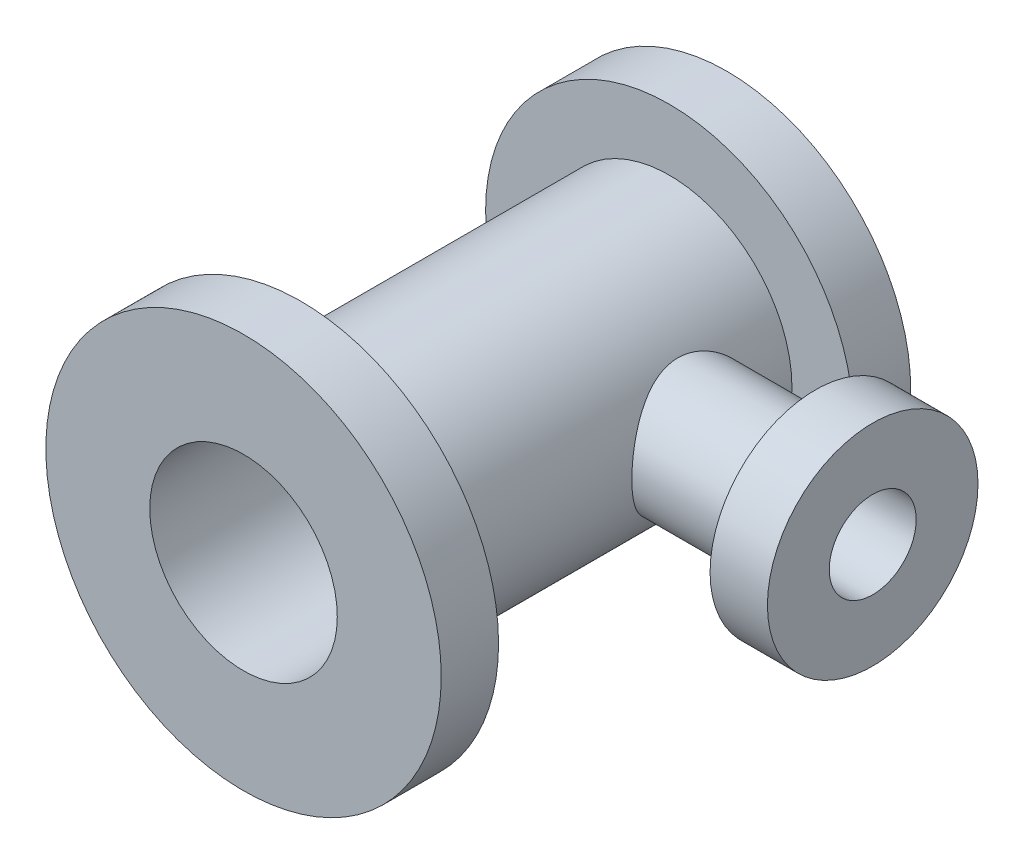
ISO-10303-21;
HEADER;
FILE_DESCRIPTION(('STEP AP214'),'2;1');
FILE_NAME('part.step','',(''),(''),'','','');
FILE_SCHEMA(('AUTOMOTIVE_DESIGN { 1 0 10303 214 1 1 1 1 }'));
ENDSEC;
DATA;
#1=APPLICATION_CONTEXT('core data for automotive mechanical design processes');
#2=APPLICATION_PROTOCOL_DEFINITION('international standard','automotive_design',2000,#1);
#3=PRODUCT_CONTEXT('',#1,'mechanical');
#4=PRODUCT('Part','Part','',(#3));
#5=PRODUCT_RELATED_PRODUCT_CATEGORY('part','',(#4));
#6=PRODUCT_DEFINITION_FORMATION('','',#4);
#7=PRODUCT_DEFINITION_CONTEXT('part definition',#1,'design');
#8=PRODUCT_DEFINITION('design','',#6,#7);
#9=PRODUCT_DEFINITION_SHAPE('','',#8);
#10=(LENGTH_UNIT() NAMED_UNIT(*) SI_UNIT(.MILLI.,.METRE.));
#11=(NAMED_UNIT(*) PLANE_ANGLE_UNIT() SI_UNIT($,.RADIAN.));
#12=(NAMED_UNIT(*) SI_UNIT($,.STERADIAN.) SOLID_ANGLE_UNIT());
#13=UNCERTAINTY_MEASURE_WITH_UNIT(LENGTH_MEASURE(1.E-05),#10,'distance_accuracy_value','');
#14=(GEOMETRIC_REPRESENTATION_CONTEXT(3) GLOBAL_UNCERTAINTY_ASSIGNED_CONTEXT((#13)) GLOBAL_UNIT_ASSIGNED_CONTEXT((#10,
#11,#12)) REPRESENTATION_CONTEXT('',''));
#15=CARTESIAN_POINT('',(0.,0.,0.));
#16=DIRECTION('',(0.,0.,1.));
#17=DIRECTION('',(1.,0.,0.));
#18=AXIS2_PLACEMENT_3D('',#15,#16,#17);
#19=CARTESIAN_POINT('',(0.,0.,113.));
#20=DIRECTION('',(0.,0.,-1.));
#21=DIRECTION('',(-1.,0.,0.));
#22=AXIS2_PLACEMENT_3D('',#19,#20,#21);
#23=CYLINDRICAL_SURFACE('',#22,29.8978260869565);
#24=CARTESIAN_POINT('',(0.,0.,99.));
#25=DIRECTION('',(0.,0.,1.));
#26=DIRECTION('',(1.,0.,0.));
#27=AXIS2_PLACEMENT_3D('',#24,#25,#26);
#28=CIRCLE('',#27,29.8978260869565);
#29=CARTESIAN_POINT('',(29.8978260869565,0.,99.));
#30=VERTEX_POINT('',#29);
#31=EDGE_CURVE('E46',#30,#30,#28,.T.);
#32=ORIENTED_EDGE('',*,*,#31,.F.);
#33=EDGE_LOOP('',(#32));
#34=FACE_BOUND('',#33,.T.);
#35=CARTESIAN_POINT('',(29.8978260869565,0.,48.0921907668277));
#36=CARTESIAN_POINT('',(29.897826796806,-0.410481878840182,48.0921916495138));
#37=CARTESIAN_POINT('',(29.8893543502388,-0.820953845497934,48.0760821582374));
#38=CARTESIAN_POINT('',(29.8556824616018,-1.63884193327181,48.0118429802466));
#39=CARTESIAN_POINT('',(29.8304768920757,-2.04625687965635,47.9637015638351));
#40=CARTESIAN_POINT('',(29.7639365853433,-2.85536546245785,47.8358991742283));
#41=CARTESIAN_POINT('',(29.7225786628537,-3.25705001041393,47.7561928901277));
#42=CARTESIAN_POINT('',(29.624784987848,-4.05119510131826,47.5662196136342));
#43=CARTESIAN_POINT('',(29.568350464529,-4.44365639340293,47.4559551126289));
#44=CARTESIAN_POINT('',(29.4420337661322,-5.21525525194695,47.2065770643136));
#45=CARTESIAN_POINT('',(29.3722069449573,-5.5944403167897,47.0675820899157));
#46=CARTESIAN_POINT('',(29.2205762304388,-6.3389489195439,46.7618288283908));
#47=CARTESIAN_POINT('',(29.1387721350128,-6.70427222344647,46.5950700728224));
#48=CARTESIAN_POINT('',(28.9650146078412,-7.41911211191844,46.2352518574877));
#49=CARTESIAN_POINT('',(28.8730627909539,-7.76863119904893,46.0421965812778));
#50=CARTESIAN_POINT('',(28.6809499559998,-8.45035877057883,45.6311856460707));
#51=CARTESIAN_POINT('',(28.5807881473273,-8.78256558279061,45.4132275881882));
#52=CARTESIAN_POINT('',(28.36764106439,-9.44918994673119,44.9389291666651));
#53=CARTESIAN_POINT('',(28.2542454025769,-9.78235862923837,44.6810175465435));
#54=CARTESIAN_POINT('',(28.0231021881324,-10.426059593368,44.140125490744));
#55=CARTESIAN_POINT('',(27.9053544799797,-10.7365910648641,43.8571441586889));
#56=CARTESIAN_POINT('',(27.6681522279021,-11.3338727125214,43.2674158074575));
#57=CARTESIAN_POINT('',(27.5486967479623,-11.620609211354,42.9606553132872));
#58=CARTESIAN_POINT('',(27.3109154586117,-12.1689466374574,42.3247616034055));
#59=CARTESIAN_POINT('',(27.1925902106816,-12.4305356028478,41.9956178665503));
#60=CARTESIAN_POINT('',(26.9498167885033,-12.9489908971984,41.2865215262227));
#61=CARTESIAN_POINT('',(26.8257467344922,-13.2034137245318,40.9046469357565));
#62=CARTESIAN_POINT('',(26.5864773943472,-13.6788170702555,40.118232127753));
#63=CARTESIAN_POINT('',(26.4712737527701,-13.8998140605697,39.7137032096071));
#64=CARTESIAN_POINT('',(26.2537205255951,-14.3064795143731,38.8840566421401));
#65=CARTESIAN_POINT('',(26.1513671841473,-14.4921583087762,38.4589450592338));
#66=CARTESIAN_POINT('',(25.9634781058224,-14.826145177324,37.5906879228836));
#67=CARTESIAN_POINT('',(25.8779403185414,-14.9744578083322,37.1475445761054));
#68=CARTESIAN_POINT('',(25.7320611804424,-15.2236852833303,36.274441167124));
#69=CARTESIAN_POINT('',(25.6704876384423,-15.3269663292125,35.8453638089964));
#70=CARTESIAN_POINT('',(25.5680123281331,-15.4973120906402,34.977622520631));
#71=CARTESIAN_POINT('',(25.5271095849252,-15.5643785141893,34.5389590435223));
#72=CARTESIAN_POINT('',(25.4678693275911,-15.6611261986547,33.6564550230244));
#73=CARTESIAN_POINT('',(25.4495088397351,-15.6908455222491,33.2126202165612));
#74=CARTESIAN_POINT('',(25.436156616008,-15.7124834448352,32.3237007852233));
#75=CARTESIAN_POINT('',(25.4411622070454,-15.7044063677543,31.8786163091335));
#76=CARTESIAN_POINT('',(25.4720304534629,-15.6542747384011,31.0518354310559));
#77=CARTESIAN_POINT('',(25.4949723486768,-15.6169768662411,30.6697288318546));
#78=CARTESIAN_POINT('',(25.5572962823597,-15.5147735910132,29.910626659278));
#79=CARTESIAN_POINT('',(25.5966765602637,-15.4498711444045,29.5336305430287));
#80=CARTESIAN_POINT('',(25.6905751152152,-15.293222949442,28.7870841772248));
#81=CARTESIAN_POINT('',(25.7450980426034,-15.2014689544531,28.4175362524795));
#82=CARTESIAN_POINT('',(25.8675698270725,-14.9921153687821,27.6881205002735));
#83=CARTESIAN_POINT('',(25.9355194612678,-14.8745142820708,27.3282532344829));
#84=CARTESIAN_POINT('',(26.0845395897857,-14.6116432450236,26.6120467842195));
#85=CARTESIAN_POINT('',(26.165870775353,-14.4658105667741,26.2559689124137));
#86=CARTESIAN_POINT('',(26.3383059162598,-14.1494204971277,25.5572978300634));
#87=CARTESIAN_POINT('',(26.429413339455,-13.9788543246044,25.214709463853));
#88=CARTESIAN_POINT('',(26.6191095350767,-13.6141563809211,24.5443954644303));
#89=CARTESIAN_POINT('',(26.7176998800904,-13.420019651078,24.2166729786331));
#90=CARTESIAN_POINT('',(26.9200678712417,-13.0093180167389,23.5773305182626));
#91=CARTESIAN_POINT('',(27.0238452871168,-12.7927541073649,23.2657098301512));
#92=CARTESIAN_POINT('',(27.2493495836431,-12.305883247851,22.6164907613336));
#93=CARTESIAN_POINT('',(27.3715317381663,-12.0323122432555,22.2814923957848));
#94=CARTESIAN_POINT('',(27.6166046595009,-11.458640790157,21.6353080911506));
#95=CARTESIAN_POINT('',(27.7394954636294,-11.1585389324042,21.3241234186262));
#96=CARTESIAN_POINT('',(27.9830222083567,-10.5329580938146,20.7268703484483));
#97=CARTESIAN_POINT('',(28.1036563298248,-10.2074596483694,20.4408215797824));
#98=CARTESIAN_POINT('',(28.3395770436382,-9.53289053275975,19.8958635755359));
#99=CARTESIAN_POINT('',(28.4548657304858,-9.18382922917537,19.6369436590884));
#100=CARTESIAN_POINT('',(28.6836232954765,-8.44323916052333,19.1340199462923));
#101=CARTESIAN_POINT('',(28.796620298209,-8.05042506768877,18.8916884997131));
#102=CARTESIAN_POINT('',(29.0103892694386,-7.24237270600434,18.4413265269522));
#103=CARTESIAN_POINT('',(29.1111605661446,-6.82713320670947,18.2332978854521));
#104=CARTESIAN_POINT('',(29.2974659708319,-5.97725530276267,17.8539356530857));
#105=CARTESIAN_POINT('',(29.3830106388235,-5.54263060584944,17.6825766142123));
#106=CARTESIAN_POINT('',(29.5363169324605,-4.65701926455056,17.3785523981369));
#107=CARTESIAN_POINT('',(29.6040808439837,-4.20603473186391,17.2458822468824));
#108=CARTESIAN_POINT('',(29.7145545779553,-3.33194600758355,17.0310414839403));
#109=CARTESIAN_POINT('',(29.758947765912,-2.90989403395334,16.9454473415893));
#110=CARTESIAN_POINT('',(29.8299181386831,-2.05871534039453,16.8091011862667));
#111=CARTESIAN_POINT('',(29.8564963483133,-1.62958902887617,16.758347169095));
#112=CARTESIAN_POINT('',(29.8910665322588,-0.768065831085699,16.6924015751397));
#113=CARTESIAN_POINT('',(29.89906710886,-0.335670551586267,16.6771935389349));
#114=CARTESIAN_POINT('',(29.8962730858333,0.528828281213647,16.6825116503364));
#115=CARTESIAN_POINT('',(29.8854794971145,0.960931848954217,16.7030358759596));
#116=CARTESIAN_POINT('',(29.8471750145983,1.78340949732516,16.7761610387292));
#117=CARTESIAN_POINT('',(29.8212108435245,2.17412420864949,16.8257955943256));
#118=CARTESIAN_POINT('',(29.7545290270125,2.94947196831378,16.9539775679393));
#119=CARTESIAN_POINT('',(29.7138124528202,3.33410545612598,17.0325228866075));
#120=CARTESIAN_POINT('',(29.6185665633512,4.09481231366989,17.2176766364355));
#121=CARTESIAN_POINT('',(29.5640365303063,4.47088523747471,17.3242865258841));
#122=CARTESIAN_POINT('',(29.4423839211606,5.21221160240684,17.5645002048226));
#123=CARTESIAN_POINT('',(29.3752608028039,5.57746457684458,17.6981051567342));
#124=CARTESIAN_POINT('',(29.2279806983522,6.30446265356324,17.9948938594646));
#125=CARTESIAN_POINT('',(29.1475312046287,6.66587198677411,18.1587539764332));
#126=CARTESIAN_POINT('',(28.9766404991293,7.37338307380989,18.5122280133582));
#127=CARTESIAN_POINT('',(28.8861992252354,7.71948473244951,18.7018420934266));
#128=CARTESIAN_POINT('',(28.6971815086286,8.39492751916615,19.1054951538063));
#129=CARTESIAN_POINT('',(28.5986028268072,8.72426399352266,19.3195408630256));
#130=CARTESIAN_POINT('',(28.3953165404155,9.36477064276463,19.7706855440698));
#131=CARTESIAN_POINT('',(28.2906083550711,9.67593909062183,20.0077867018233));
#132=CARTESIAN_POINT('',(28.065872774991,10.3107612143502,20.5299515634314));
#133=CARTESIAN_POINT('',(27.9453948444347,10.6322670318104,20.8174362557379));
#134=CARTESIAN_POINT('',(27.702404848931,11.2502010235581,21.4174240421721));
#135=CARTESIAN_POINT('',(27.5798926536419,11.5466275834645,21.7299287443507));
#136=CARTESIAN_POINT('',(27.3357995958781,12.1131856807418,22.3786407502757));
#137=CARTESIAN_POINT('',(27.2142193439545,12.3833011455285,22.7148623283607));
#138=CARTESIAN_POINT('',(26.9751763858802,12.89572987577,23.4095187286559));
#139=CARTESIAN_POINT('',(26.8577156892059,13.138029700518,23.7679641618251));
#140=CARTESIAN_POINT('',(26.6231087789152,13.6074687996836,24.5285677857999));
#141=CARTESIAN_POINT('',(26.5064458160629,13.8326996281155,24.9320574641092));
#142=CARTESIAN_POINT('',(26.2856699936,14.2477655965048,25.7598765559702));
#143=CARTESIAN_POINT('',(26.1815501301892,14.4376205222997,26.1841941516007));
#144=CARTESIAN_POINT('',(25.9898992124025,14.7798381685124,27.050925714977));
#145=CARTESIAN_POINT('',(25.9023542015896,14.9322324642625,27.4933240731411));
#146=CARTESIAN_POINT('',(25.7475523969393,15.1976060234121,28.393239335518));
#147=CARTESIAN_POINT('',(25.6802920942167,15.310592104245,28.8507536097427));
#148=CARTESIAN_POINT('',(25.5747006455475,15.4862559941898,29.7314919878449));
#149=CARTESIAN_POINT('',(25.534182271819,15.5527755660563,30.1536890994135));
#150=CARTESIAN_POINT('',(25.4739625918246,15.6512173916817,31.0035770049284));
#151=CARTESIAN_POINT('',(25.4542598021771,15.683142110779,31.4312674052074));
#152=CARTESIAN_POINT('',(25.4365446512899,15.7118581437469,32.2880515690372));
#153=CARTESIAN_POINT('',(25.4385210187365,15.7086677144982,32.7171444873947));
#154=CARTESIAN_POINT('',(25.4640507959399,15.667249828778,33.5729704057648));
#155=CARTESIAN_POINT('',(25.4876029323645,15.6290244399563,33.9997035435489));
#156=CARTESIAN_POINT('',(25.5513349028338,15.5245775999735,34.7980994964407));
#157=CARTESIAN_POINT('',(25.5892845013172,15.4620921961451,35.1704389739048));
#158=CARTESIAN_POINT('',(25.6800168447693,15.3109277797301,35.9080408413268));
#159=CARTESIAN_POINT('',(25.7328044154246,15.2222402450628,36.2733008874928));
#160=CARTESIAN_POINT('',(25.8515917405686,15.0196196868828,36.9945359525781));
#161=CARTESIAN_POINT('',(25.9175919786039,14.9056857394057,37.3505106311398));
#162=CARTESIAN_POINT('',(26.0609395751734,14.653615274564,38.0514459540991));
#163=CARTESIAN_POINT('',(26.1382881354552,14.5154761936595,38.3964054273085));
#164=CARTESIAN_POINT('',(26.3076916455172,14.206281180095,39.0959889718017));
#165=CARTESIAN_POINT('',(26.4003775940431,14.0336632213738,39.4497694056201));
#166=CARTESIAN_POINT('',(26.593865415042,13.6634526356718,40.1416739690625));
#167=CARTESIAN_POINT('',(26.6946675179758,13.4658592994166,40.4797976536788));
#168=CARTESIAN_POINT('',(26.901960222672,13.0468077437331,41.1392669782728));
#169=CARTESIAN_POINT('',(27.0084529956058,12.8253403823456,41.4606061206077));
#170=CARTESIAN_POINT('',(27.2246959097228,12.3596864932001,42.0852731941438));
#171=CARTESIAN_POINT('',(27.3344465475662,12.1154964891457,42.3885983577515));
#172=CARTESIAN_POINT('',(27.5702166807052,11.5699307199738,43.017030676705));
#173=CARTESIAN_POINT('',(27.696373951216,11.2653264685729,43.3392913612296));
#174=CARTESIAN_POINT('',(27.946517564496,10.6296191281655,43.9572192534762));
#175=CARTESIAN_POINT('',(28.0705045310439,10.2985238107362,44.2528942068802));
#176=CARTESIAN_POINT('',(28.313274042769,9.61100990306157,44.8162617894601));
#177=CARTESIAN_POINT('',(28.432052089417,9.25457009497303,45.0839304979397));
#178=CARTESIAN_POINT('',(28.6612275779652,8.51837101580878,45.5890940566541));
#179=CARTESIAN_POINT('',(28.7716253947853,8.13861278934391,45.8265902570863));
#180=CARTESIAN_POINT('',(28.9832103896157,7.35006128616432,46.2737986027857));
#181=CARTESIAN_POINT('',(29.0841724730789,6.94084257013087,46.4828690394631));
#182=CARTESIAN_POINT('',(29.2714975899284,6.10276852471047,46.8654036627689));
#183=CARTESIAN_POINT('',(29.3578586004265,5.67391048485958,47.0388629164007));
#184=CARTESIAN_POINT('',(29.5131937714316,4.80078343836859,47.3476506526748));
#185=CARTESIAN_POINT('',(29.5822090178192,4.35655373893797,47.4830693311293));
#186=CARTESIAN_POINT('',(29.7009245976356,3.45562187388797,47.7143826206935));
#187=CARTESIAN_POINT('',(29.7506359120738,2.99892695781044,47.8102997041049));
#188=CARTESIAN_POINT('',(29.8255459618844,2.11970413271916,47.9542703127049));
#189=CARTESIAN_POINT('',(29.8525857382503,1.69791998966021,48.0059285007292));
#190=CARTESIAN_POINT('',(29.8887256064625,0.850753729241778,48.0748886026608));
#191=CARTESIAN_POINT('',(29.8978253513582,0.425371542457833,48.0921898521235));
#192=CARTESIAN_POINT('',(29.8978260869565,0.,48.0921907668277));
#193=B_SPLINE_CURVE_WITH_KNOTS('',3,(#35,#36,#37,#38,#39,#40,#41,#42,#43,#44,#45,#46,#47,#48,
#49,#50,#51,#52,#53,#54,#55,#56,#57,#58,#59,#60,#61,#62,#63,#64,#65,#66,#67,#68,#69,#70,#71,#72,
#73,#74,#75,#76,#77,#78,#79,#80,#81,#82,#83,#84,#85,#86,#87,#88,#89,#90,#91,#92,#93,#94,#95,#96,
#97,#98,#99,#100,#101,#102,#103,#104,#105,#106,#107,#108,#109,#110,#111,#112,#113,#114,#115,
#116,#117,#118,#119,#120,#121,#122,#123,#124,#125,#126,#127,#128,#129,#130,#131,#132,#133,#134,
#135,#136,#137,#138,#139,#140,#141,#142,#143,#144,#145,#146,#147,#148,#149,#150,#151,#152,#153,
#154,#155,#156,#157,#158,#159,#160,#161,#162,#163,#164,#165,#166,#167,#168,#169,#170,#171,#172,
#173,#174,#175,#176,#177,#178,#179,#180,#181,#182,#183,#184,#185,#186,#187,#188,#189,#190,#191,
#192),.UNSPECIFIED.,.T.,.F.,(4,2,2,2,2,2,2,2,2,2,2,2,2,2,2,2,2,2,2,2,2,2,2,2,2,2,2,2,2,2,2,2,2,
2,2,2,2,2,2,2,2,2,2,2,2,2,2,2,2,2,2,2,2,2,2,2,2,2,2,2,2,2,2,2,2,2,2,2,2,2,2,2,2,2,2,2,2,2,4),
(0.,1.23102814466309,2.46250732496514,3.69576072097504,4.92891360035608,6.15707529280108,
7.38525770937932,8.61324496013942,9.84135060282513,11.1489525126458,12.4566011951613,
13.7649963805343,15.074010879893,16.4982744636596,17.9218338814135,19.3449762517494,
20.767944983492,22.1028047480427,23.4376015506072,24.7710368751896,26.1043196578224,
27.256779127845,28.4091152001336,29.5618055494187,30.7145626339843,31.8932420221077,
33.0723409057034,34.2516882747889,35.4309833371474,36.7778387510189,38.1247657493694,
39.4727354043253,40.8201723417034,42.2438325195619,43.6675708908205,45.0903179872562,
46.5128820869128,47.8098949389396,49.1068331732326,50.4031707464994,51.6994385939295,
52.8821910378008,54.0648576132833,55.2475856545204,56.4303646355087,57.643772309258,
58.8571875270877,60.0709377512689,61.2848031657008,62.6267694388457,63.9688220303093,
65.3116893628626,66.6552028708488,68.0831117645246,69.5102196118318,70.9361204019891,
72.3617743956099,73.6478827650815,74.9338994763903,76.2192476003449,77.5045198721,
78.641602709487,79.7790557839187,80.9165504935661,82.0541657469673,83.2661892293268,
84.4782471396105,85.6907708369302,86.9034803420326,88.2850203267926,89.6661564904246,
91.0484628423797,92.4307073153428,93.8402635803839,95.250014970974,96.6563950116317,
98.0619738593042,99.3376311805929,100.613313172168),.UNSPECIFIED.);
#194=CARTESIAN_POINT('',(29.8978260869565,0.,48.0921907668277));
#195=VERTEX_POINT('',#194);
#196=EDGE_CURVE('E50',#195,#195,#193,.T.);
#197=ORIENTED_EDGE('',*,*,#196,.F.);
#198=EDGE_LOOP('',(#197));
#199=FACE_BOUND('',#198,.T.);
#200=CARTESIAN_POINT('',(0.,0.,8.99999999999999));
#201=DIRECTION('',(0.,0.,-1.));
#202=DIRECTION('',(-1.,0.,0.));
#203=AXIS2_PLACEMENT_3D('',#200,#201,#202);
#204=CIRCLE('',#203,29.8978260869565);
#205=CARTESIAN_POINT('',(-29.8978260869565,0.,8.99999999999999));
#206=VERTEX_POINT('',#205);
#207=EDGE_CURVE('E12',#206,#206,#204,.T.);
#208=ORIENTED_EDGE('',*,*,#207,.F.);
#209=EDGE_LOOP('',(#208));
#210=FACE_BOUND('',#209,.T.);
#211=ADVANCED_FACE('F39',(#34,#199,#210),#23,.T.);
#212=CARTESIAN_POINT('',(0.,0.,113.));
#213=DIRECTION('',(0.,0.,1.));
#214=DIRECTION('',(1.,0.,0.));
#215=AXIS2_PLACEMENT_3D('',#212,#213,#214);
#216=PLANE('',#215);
#217=CARTESIAN_POINT('',(0.,0.,113.));
#218=DIRECTION('',(0.,0.,1.));
#219=DIRECTION('',(1.,0.,0.));
#220=AXIS2_PLACEMENT_3D('',#217,#218,#219);
#221=CIRCLE('',#220,22.8921839773275);
#222=CARTESIAN_POINT('',(22.8921839773275,0.,113.));
#223=VERTEX_POINT('',#222);
#224=EDGE_CURVE('E54',#223,#223,#221,.T.);
#225=ORIENTED_EDGE('',*,*,#224,.F.);
#226=EDGE_LOOP('',(#225));
#227=FACE_BOUND('',#226,.T.);
#228=CARTESIAN_POINT('',(0.,0.,113.));
#229=DIRECTION('',(0.,0.,1.));
#230=DIRECTION('',(1.,0.,0.));
#231=AXIS2_PLACEMENT_3D('',#228,#229,#230);
#232=CIRCLE('',#231,48.2646440835897);
#233=CARTESIAN_POINT('',(48.2646440835897,0.,113.));
#234=VERTEX_POINT('',#233);
#235=EDGE_CURVE('E89',#234,#234,#232,.T.);
#236=ORIENTED_EDGE('',*,*,#235,.T.);
#237=EDGE_LOOP('',(#236));
#238=FACE_BOUND('',#237,.T.);
#239=ADVANCED_FACE('F80',(#227,#238),#216,.T.);
#240=CARTESIAN_POINT('',(59.,0.,32.3858732123767));
#241=DIRECTION('',(-1.,0.,0.));
#242=DIRECTION('',(0.,0.,1.));
#243=AXIS2_PLACEMENT_3D('',#240,#241,#242);
#244=CYLINDRICAL_SURFACE('',#243,15.706317554451);
#245=CARTESIAN_POINT('',(59.,0.,32.3858732123767));
#246=DIRECTION('',(1.,0.,0.));
#247=DIRECTION('',(0.,0.,-1.));
#248=AXIS2_PLACEMENT_3D('',#245,#246,#247);
#249=CIRCLE('',#248,15.706317554451);
#250=CARTESIAN_POINT('',(59.,0.,16.6795556579257));
#251=VERTEX_POINT('',#250);
#252=EDGE_CURVE('E64',#251,#251,#249,.T.);
#253=ORIENTED_EDGE('',*,*,#252,.F.);
#254=EDGE_LOOP('',(#253));
#255=FACE_BOUND('',#254,.T.);
#256=ORIENTED_EDGE('',*,*,#196,.T.);
#257=EDGE_LOOP('',(#256));
#258=FACE_BOUND('',#257,.T.);
#259=ADVANCED_FACE('F76',(#255,#258),#244,.T.);
#260=CARTESIAN_POINT('',(59.,0.,32.3858732123767));
#261=DIRECTION('',(-1.,0.,0.));
#262=DIRECTION('',(0.,0.,1.));
#263=AXIS2_PLACEMENT_3D('',#260,#261,#262);
#264=CYLINDRICAL_SURFACE('',#263,10.6169684355044);
#265=CARTESIAN_POINT('',(22.8921839773275,0.,21.7689047768723));
#266=CARTESIAN_POINT('',(22.8921822882694,-0.281575967226107,21.7689067441796));
#267=CARTESIAN_POINT('',(22.8869756446271,-0.5632064018111,21.7801205365966));
#268=CARTESIAN_POINT('',(22.8662783625415,-1.12442413397298,21.8248599975536));
#269=CARTESIAN_POINT('',(22.8507823156619,-1.40401027882662,21.858397400113));
#270=CARTESIAN_POINT('',(22.8098704769328,-1.95949025529512,21.9474972774004));
#271=CARTESIAN_POINT('',(22.7844349114588,-2.23537558583294,22.0031036595042));
#272=CARTESIAN_POINT('',(22.7243074062754,-2.7808701879684,22.1357235976234));
#273=CARTESIAN_POINT('',(22.6896166218422,-3.05048023830987,22.2127344818872));
#274=CARTESIAN_POINT('',(22.6119935021561,-3.58069387320225,22.3870609719117));
#275=CARTESIAN_POINT('',(22.5690920907893,-3.84132705377103,22.4843005058912));
#276=CARTESIAN_POINT('',(22.4759994437018,-4.35306600840717,22.6983673957416));
#277=CARTESIAN_POINT('',(22.4258080046935,-4.60417151654218,22.8151952978623));
#278=CARTESIAN_POINT('',(22.3193303470222,-5.09536161284093,23.0674237747334));
#279=CARTESIAN_POINT('',(22.263046932206,-5.33545119926805,23.2028158128858));
#280=CARTESIAN_POINT('',(22.1456159479772,-5.8036246250175,23.4912906984168));
#281=CARTESIAN_POINT('',(22.0844664708748,-6.03170369693103,23.6443804947746));
#282=CARTESIAN_POINT('',(21.9552739855454,-6.48667335478897,23.9759656947759));
#283=CARTESIAN_POINT('',(21.8870370371685,-6.71283456382628,24.1553866326242));
#284=CARTESIAN_POINT('',(21.7483373345992,-7.14943265499824,24.5316582842724));
#285=CARTESIAN_POINT('',(21.6778744736551,-7.35986878134464,24.7285098348406));
#286=CARTESIAN_POINT('',(21.5364099715299,-7.76408470177036,25.1386699704162));
#287=CARTESIAN_POINT('',(21.4654080651122,-7.95785562793088,25.3519872040191));
#288=CARTESIAN_POINT('',(21.3246718866172,-8.32764119399472,25.7939503159768));
#289=CARTESIAN_POINT('',(21.2549378395527,-8.50365270679096,26.022598882141));
#290=CARTESIAN_POINT('',(21.1141712209114,-8.84763202846311,26.5093216130517));
#291=CARTESIAN_POINT('',(21.0433451590805,-9.01434815333681,26.7683424922214));
#292=CARTESIAN_POINT('',(20.9074744651017,-9.32514698327713,27.3009279014072));
#293=CARTESIAN_POINT('',(20.8424274081967,-9.46923920054883,27.5744862540501));
#294=CARTESIAN_POINT('',(20.7203089567378,-9.73355473314463,28.1345464384199));
#295=CARTESIAN_POINT('',(20.6632355485958,-9.85378407780545,28.421044978086));
#296=CARTESIAN_POINT('',(20.5591619939307,-10.0691245917491,29.0051051337999));
#297=CARTESIAN_POINT('',(20.5121608952811,-10.1642381354038,29.3026657010407));
#298=CARTESIAN_POINT('',(20.4323866102228,-10.3236217733086,29.8898360295947));
#299=CARTESIAN_POINT('',(20.3989696616506,-10.3893082026215,30.1789735875851));
#300=CARTESIAN_POINT('',(20.3440865707988,-10.4963739230744,30.7628437010289));
#301=CARTESIAN_POINT('',(20.3226199828176,-10.5377541207444,31.0575760473946));
#302=CARTESIAN_POINT('',(20.2925167975403,-10.5956084444542,31.6499364355439));
#303=CARTESIAN_POINT('',(20.2838718017263,-10.6120988741451,31.9475624531525));
#304=CARTESIAN_POINT('',(20.2797474954394,-10.6199791815479,32.5432276022866));
#305=CARTESIAN_POINT('',(20.284267214165,-10.6113709101052,32.8412667017304));
#306=CARTESIAN_POINT('',(20.3051772863941,-10.5712955161718,33.4054682561315));
#307=CARTESIAN_POINT('',(20.3203401967278,-10.5421910917912,33.6718484014053));
#308=CARTESIAN_POINT('',(20.3606760575439,-10.4640762004817,34.2009961340078));
#309=CARTESIAN_POINT('',(20.3858523818289,-10.4150590242639,34.4637624728401));
#310=CARTESIAN_POINT('',(20.4454045062337,-10.2976619450551,34.9838010022312));
#311=CARTESIAN_POINT('',(20.4797785504876,-10.2292857376031,35.2410742313258));
#312=CARTESIAN_POINT('',(20.5567012443248,-10.0738094713269,35.7487426333096));
#313=CARTESIAN_POINT('',(20.5992531281175,-9.98670200295219,35.9991350400093));
#314=CARTESIAN_POINT('',(20.6923526648369,-9.79236889145876,36.4971479544345));
#315=CARTESIAN_POINT('',(20.7430588352916,-9.68473427568919,36.7445789760829));
#316=CARTESIAN_POINT('',(20.8503682143046,-9.45149250171575,37.2296073308644));
#317=CARTESIAN_POINT('',(20.9069739351108,-9.32587767829948,37.4672004139653));
#318=CARTESIAN_POINT('',(21.0246172704183,-9.05753897862258,37.9314019457079));
#319=CARTESIAN_POINT('',(21.0856554348956,-8.914812977778,38.1580090253731));
#320=CARTESIAN_POINT('',(21.2106927988527,-8.61308692776776,38.5992619996851));
#321=CARTESIAN_POINT('',(21.2746922037195,-8.45408574885123,38.813907062382));
#322=CARTESIAN_POINT('',(21.4111532551774,-8.10270478416518,39.252709839653));
#323=CARTESIAN_POINT('',(21.4837857904012,-7.90857413846347,39.4754151460039));
#324=CARTESIAN_POINT('',(21.628942849933,-7.50249260587972,39.9038326683665));
#325=CARTESIAN_POINT('',(21.7014673998186,-7.29054700259494,40.1095498871084));
#326=CARTESIAN_POINT('',(21.8446147035107,-6.8497175839829,40.5030611763639));
#327=CARTESIAN_POINT('',(21.9152360192258,-6.62082142453037,40.6908419523229));
#328=CARTESIAN_POINT('',(22.0526862238924,-6.1475051159558,41.0470446466874));
#329=CARTESIAN_POINT('',(22.1195166194119,-5.90309121682305,41.2154742832014));
#330=CARTESIAN_POINT('',(22.249946729704,-5.39111760317722,41.5374019790109));
#331=CARTESIAN_POINT('',(22.3133505803321,-5.12304649157335,41.6901679887376));
#332=CARTESIAN_POINT('',(22.4324923915511,-4.57323556610767,41.972374853835));
#333=CARTESIAN_POINT('',(22.4882300739081,-4.29149525664166,42.1018148626714));
#334=CARTESIAN_POINT('',(22.5903799395351,-3.71645507188826,42.3359633593254));
#335=CARTESIAN_POINT('',(22.6367972680244,-3.42316168194456,42.440685498061));
#336=CARTESIAN_POINT('',(22.7189318647789,-2.82713301884324,42.6242590778053));
#337=CARTESIAN_POINT('',(22.7546501705531,-2.5243986643433,42.7031130273829));
#338=CARTESIAN_POINT('',(22.8120451466973,-1.93487808483715,42.8290637558629));
#339=CARTESIAN_POINT('',(22.8345701512204,-1.64858557475775,42.8780898813085));
#340=CARTESIAN_POINT('',(22.8688768879626,-1.07231092199413,42.9525453388554));
#341=CARTESIAN_POINT('',(22.8806591501175,-0.782328962024875,42.9779758349225));
#342=CARTESIAN_POINT('',(22.8931454839239,-0.201113128101857,43.0049213531644));
#343=CARTESIAN_POINT('',(22.8938531555396,0.0901203082468285,43.0064441469026));
#344=CARTESIAN_POINT('',(22.8841789709404,0.671538168303935,42.9855744581885));
#345=CARTESIAN_POINT('',(22.8737974821925,0.961722626453147,42.9631827682023));
#346=CARTESIAN_POINT('',(22.8432624073786,1.52003647328392,42.8969798268573));
#347=CARTESIAN_POINT('',(22.8237833469317,1.78837973811229,42.8546455581391));
#348=CARTESIAN_POINT('',(22.775860435613,2.32024970645021,42.7497492611334));
#349=CARTESIAN_POINT('',(22.7474170653333,2.58377666736895,42.6871883172281));
#350=CARTESIAN_POINT('',(22.6822387654519,3.10434429914622,42.5424503479246));
#351=CARTESIAN_POINT('',(22.6455033128116,3.36138455970626,42.4602720851082));
#352=CARTESIAN_POINT('',(22.5645893688708,3.86743752432454,42.2770498715585));
#353=CARTESIAN_POINT('',(22.5204105799749,4.11644990694209,42.1760051665));
#354=CARTESIAN_POINT('',(22.4241425554302,4.61255626584255,41.9525124823304));
#355=CARTESIAN_POINT('',(22.3718530343814,4.85935971252581,41.8295053668121));
#356=CARTESIAN_POINT('',(22.2616086239997,5.34174069243813,41.5652812398749));
#357=CARTESIAN_POINT('',(22.2036516986065,5.57731414565664,41.4240576781948));
#358=CARTESIAN_POINT('',(22.0232031767457,6.26537694421796,40.974529815867));
#359=CARTESIAN_POINT('',(21.8940805789843,6.69947229946253,40.6402487701606));
#360=CARTESIAN_POINT('',(21.6178874251119,7.54547085704123,39.878367685962));
#361=CARTESIAN_POINT('',(21.4702322098236,7.95216885742328,39.4451830976066));
#362=CARTESIAN_POINT('',(21.2547567819384,8.50450968237154,38.7483774493403));
#363=CARTESIAN_POINT('',(21.1838902720188,8.67909704168661,38.5081051287427));
#364=CARTESIAN_POINT('',(21.0461098278582,9.00805763515105,38.0128810357565));
#365=CARTESIAN_POINT('',(20.9791963894917,9.16242833625989,37.7579274296309));
#366=CARTESIAN_POINT('',(20.8493518173585,9.45425586330297,37.2265186466687));
#367=CARTESIAN_POINT('',(20.7866127720053,9.59102591239831,36.9496389818326));
#368=CARTESIAN_POINT('',(20.6697185103205,9.84041627883364,36.3835985194879));
#369=CARTESIAN_POINT('',(20.615559230573,9.95304803714913,36.0944436183599));
#370=CARTESIAN_POINT('',(20.517864324533,10.1529166405693,35.5059380631463));
#371=CARTESIAN_POINT('',(20.4743217471372,10.240170108932,35.2065942272131));
#372=CARTESIAN_POINT('',(20.3995974846025,10.3882344746264,34.599931178614));
#373=CARTESIAN_POINT('',(20.3684142270445,10.4490487357916,34.2926129857927));
#374=CARTESIAN_POINT('',(20.3219380801576,10.5391289706024,33.7005082619938));
#375=CARTESIAN_POINT('',(20.3054725574388,10.570731841809,33.4161675712162));
#376=CARTESIAN_POINT('',(20.2845252140654,10.610874091784,32.8454262008085));
#377=CARTESIAN_POINT('',(20.2800426451013,10.6194149107281,32.5590256509321));
#378=CARTESIAN_POINT('',(20.2832338435712,10.6133180625013,31.9866112191008));
#379=CARTESIAN_POINT('',(20.2909047604203,10.5986858305412,31.7005972622179));
#380=CARTESIAN_POINT('',(20.3181025309054,10.5464525195633,31.1312524649853));
#381=CARTESIAN_POINT('',(20.3376291156704,10.5088519614371,30.8479215639355));
#382=CARTESIAN_POINT('',(20.3860069108411,10.4146715689526,30.3062773067528));
#383=CARTESIAN_POINT('',(20.4140917269453,10.359640692443,30.0476234739645));
#384=CARTESIAN_POINT('',(20.4789888352968,10.2307529694501,29.5360824827351));
#385=CARTESIAN_POINT('',(20.5158040749145,10.1568897645828,29.2831973034518));
#386=CARTESIAN_POINT('',(20.597076421497,9.99104825267418,28.7847689417048));
#387=CARTESIAN_POINT('',(20.6415321397943,9.89907323703708,28.5392244345678));
#388=CARTESIAN_POINT('',(20.7368989473016,9.69770684992544,28.0565642306344));
#389=CARTESIAN_POINT('',(20.7878129430589,9.58830763098736,27.8194523908622));
#390=CARTESIAN_POINT('',(20.8983084459473,9.34514699360411,27.3395595531671));
#391=CARTESIAN_POINT('',(20.9582397549705,9.21025661215483,27.0974310825928));
#392=CARTESIAN_POINT('',(21.0823441970013,8.92252171848361,26.6252237480197));
#393=CARTESIAN_POINT('',(21.1465176537376,8.76967583534015,26.3951458060331));
#394=CARTESIAN_POINT('',(21.2775126788085,8.44688593955946,25.9480015141867));
#395=CARTESIAN_POINT('',(21.3443350758645,8.27693655008824,25.7309392905201));
#396=CARTESIAN_POINT('',(21.4790265926839,7.92084244623192,25.3108387937219));
#397=CARTESIAN_POINT('',(21.5468958546018,7.73469551615428,25.1078024460526));
#398=CARTESIAN_POINT('',(21.688812764644,7.32791575061944,24.6973626581735));
#399=CARTESIAN_POINT('',(21.7628076699032,7.10569298258508,24.4915129659588));
#400=CARTESIAN_POINT('',(21.9081564422751,6.64404310683898,24.0992312487712));
#401=CARTESIAN_POINT('',(21.9795111115718,6.40462129084203,23.9127932941704));
#402=CARTESIAN_POINT('',(22.1177409323722,5.90962700932121,23.5604166641499));
#403=CARTESIAN_POINT('',(22.1846127799088,5.65404289556489,23.3944930339511));
#404=CARTESIAN_POINT('',(22.3119927315317,5.12837088656732,23.0846420934875));
#405=CARTESIAN_POINT('',(22.3725012897734,4.85828402848498,22.9407132130992));
#406=CARTESIAN_POINT('',(22.4851249169358,4.30696136547572,22.6769643121498));
#407=CARTESIAN_POINT('',(22.5372884336891,4.0258026755464,22.5570040456769));
#408=CARTESIAN_POINT('',(22.632159264694,3.45278968137149,22.3413749893616));
#409=CARTESIAN_POINT('',(22.6748676600494,3.16093660438026,22.2457034221522));
#410=CARTESIAN_POINT('',(22.7494693418278,2.56950469417568,22.0799646959202));
#411=CARTESIAN_POINT('',(22.7813897353938,2.26994729112871,22.0098333267817));
#412=CARTESIAN_POINT('',(22.8335667698024,1.66503583109763,21.8957686774214));
#413=CARTESIAN_POINT('',(22.8538311845839,1.35968577823935,21.8518179353684));
#414=CARTESIAN_POINT('',(22.8760103759791,0.878019483089143,21.8038133737649));
#415=CARTESIAN_POINT('',(22.8820690256651,0.702739285929916,21.7907294156286));
#416=CARTESIAN_POINT('',(22.890156391787,0.351646479107204,21.7732744206168));
#417=CARTESIAN_POINT('',(22.8921850320824,0.175833859447296,21.7689035483611));
#418=CARTESIAN_POINT('',(22.8921839773275,0.,21.7689047768723));
#419=B_SPLINE_CURVE_WITH_KNOTS('',3,(#265,#266,#267,#268,#269,#270,#271,#272,#273,#274,#275,
#276,#277,#278,#279,#280,#281,#282,#283,#284,#285,#286,#287,#288,#289,#290,#291,#292,#293,#294,
#295,#296,#297,#298,#299,#300,#301,#302,#303,#304,#305,#306,#307,#308,#309,#310,#311,#312,#313,
#314,#315,#316,#317,#318,#319,#320,#321,#322,#323,#324,#325,#326,#327,#328,#329,#330,#331,#332,
#333,#334,#335,#336,#337,#338,#339,#340,#341,#342,#343,#344,#345,#346,#347,#348,#349,#350,#351,
#352,#353,#354,#355,#356,#357,#358,#359,#360,#361,#362,#363,#364,#365,#366,#367,#368,#369,#370,
#371,#372,#373,#374,#375,#376,#377,#378,#379,#380,#381,#382,#383,#384,#385,#386,#387,#388,#389,
#390,#391,#392,#393,#394,#395,#396,#397,#398,#399,#400,#401,#402,#403,#404,#405,#406,#407,#408,
#409,#410,#411,#412,#413,#414,#415,#416,#417,#418),.UNSPECIFIED.,.T.,.F.,(4,2,2,2,2,2,2,2,2,2,2,
2,2,2,2,2,2,2,2,2,2,2,2,2,2,2,2,2,2,2,2,2,2,2,2,2,2,2,2,2,2,2,2,2,2,2,2,2,2,2,2,2,2,2,2,2,2,2,2,
2,2,2,2,2,2,2,2,2,2,2,2,2,2,2,2,2,4),(0.,0.844552668929398,1.68954961328413,2.53623621883446,
3.38281718673289,4.22627026492232,5.06974686792382,5.91283689639875,6.7562590936267,
7.64523001201843,8.53424362921277,9.42372742033635,10.3133675609203,11.2604072298352,
12.2070476441515,13.1534485692739,14.09975999246,14.9936678209627,15.8875423079819,
16.7808310220792,17.6740538643397,18.4782913157592,19.2827999673909,20.0871551459049,
20.8918290915325,21.7146286641682,22.5377800582328,23.3610337637248,24.1843446546511,
25.0960383495001,26.0074626000027,26.9195572427546,27.8312868287283,28.7750332588004,
29.7188139319022,30.6620721580533,31.6052388846394,32.478087992124,33.3508940399162,
34.2234163629129,35.0959097736014,35.9120460359041,36.7281385511811,37.5442825574295,
38.3604592020544,39.2015470918916,40.042938267234,41.7248474759787,43.5528902192914,
44.4680614110177,45.383347159381,46.3274924212932,47.2711891862332,48.2142664127181,
49.1572236173065,50.015765009152,50.8742527856847,51.7325392347814,52.5908062197892,
53.3877171180895,54.1848974355963,54.9819330174154,55.7793285862493,56.6291599520261,
57.4790562455481,58.3292205608006,59.1795013550305,60.1138680849764,61.0479485549885,
61.9827100670526,62.9174048187623,63.8464590632956,64.7754070243275,65.7020031440224,
66.6279805530066,67.1553627409769,67.682754892897),.UNSPECIFIED.);
#420=CARTESIAN_POINT('',(22.8921839773275,0.,21.7689047768723));
#421=VERTEX_POINT('',#420);
#422=EDGE_CURVE('E57',#421,#421,#419,.T.);
#423=ORIENTED_EDGE('',*,*,#422,.T.);
#424=EDGE_LOOP('',(#423));
#425=FACE_BOUND('',#424,.T.);
#426=CARTESIAN_POINT('',(73.,0.,32.3858732123767));
#427=DIRECTION('',(1.,0.,0.));
#428=DIRECTION('',(0.,0.,-1.));
#429=AXIS2_PLACEMENT_3D('',#426,#427,#428);
#430=CIRCLE('',#429,10.6169684355044);
#431=CARTESIAN_POINT('',(73.,0.,21.7689047768723));
#432=VERTEX_POINT('',#431);
#433=EDGE_CURVE('E107',#432,#432,#430,.T.);
#434=ORIENTED_EDGE('',*,*,#433,.T.);
#435=EDGE_LOOP('',(#434));
#436=FACE_BOUND('',#435,.T.);
#437=ADVANCED_FACE('F74',(#425,#436),#264,.F.);
#438=CARTESIAN_POINT('',(0.,0.,113.));
#439=DIRECTION('',(0.,0.,-1.));
#440=DIRECTION('',(-1.,0.,0.));
#441=AXIS2_PLACEMENT_3D('',#438,#439,#440);
#442=CYLINDRICAL_SURFACE('',#441,22.8921839773275);
#443=ORIENTED_EDGE('',*,*,#422,.F.);
#444=EDGE_LOOP('',(#443));
#445=FACE_BOUND('',#444,.T.);
#446=ORIENTED_EDGE('',*,*,#224,.T.);
#447=EDGE_LOOP('',(#446));
#448=FACE_BOUND('',#447,.T.);
#449=CARTESIAN_POINT('',(0.,0.,-5.));
#450=DIRECTION('',(0.,0.,-1.));
#451=DIRECTION('',(-1.,0.,0.));
#452=AXIS2_PLACEMENT_3D('',#449,#450,#451);
#453=CIRCLE('',#452,22.8921839773275);
#454=CARTESIAN_POINT('',(-22.8921839773275,0.,-5.));
#455=VERTEX_POINT('',#454);
#456=EDGE_CURVE('E98',#455,#455,#453,.T.);
#457=ORIENTED_EDGE('',*,*,#456,.T.);
#458=EDGE_LOOP('',(#457));
#459=FACE_BOUND('',#458,.T.);
#460=ADVANCED_FACE('F66',(#445,#448,#459),#442,.F.);
#461=CARTESIAN_POINT('',(0.,0.,99.));
#462=DIRECTION('',(0.,0.,1.));
#463=DIRECTION('',(1.,0.,0.));
#464=AXIS2_PLACEMENT_3D('',#461,#462,#463);
#465=CYLINDRICAL_SURFACE('',#464,48.2646440835897);
#466=CARTESIAN_POINT('',(0.,0.,99.));
#467=DIRECTION('',(0.,0.,1.));
#468=DIRECTION('',(1.,0.,0.));
#469=AXIS2_PLACEMENT_3D('',#466,#467,#468);
#470=CIRCLE('',#469,48.2646440835897);
#471=CARTESIAN_POINT('',(48.2646440835897,0.,99.));
#472=VERTEX_POINT('',#471);
#473=EDGE_CURVE('E65',#472,#472,#470,.T.);
#474=ORIENTED_EDGE('',*,*,#473,.T.);
#475=EDGE_LOOP('',(#474));
#476=FACE_BOUND('',#475,.T.);
#477=ORIENTED_EDGE('',*,*,#235,.F.);
#478=EDGE_LOOP('',(#477));
#479=FACE_BOUND('',#478,.T.);
#480=ADVANCED_FACE('F72',(#476,#479),#465,.T.);
#481=CARTESIAN_POINT('',(0.,0.,99.));
#482=DIRECTION('',(0.,0.,1.));
#483=DIRECTION('',(1.,0.,0.));
#484=AXIS2_PLACEMENT_3D('',#481,#482,#483);
#485=PLANE('',#484);
#486=ORIENTED_EDGE('',*,*,#31,.T.);
#487=EDGE_LOOP('',(#486));
#488=FACE_BOUND('',#487,.T.);
#489=ORIENTED_EDGE('',*,*,#473,.F.);
#490=EDGE_LOOP('',(#489));
#491=FACE_BOUND('',#490,.T.);
#492=ADVANCED_FACE('F147',(#488,#491),#485,.F.);
#493=CARTESIAN_POINT('',(0.,0.,8.99999999999999));
#494=DIRECTION('',(0.,0.,-1.));
#495=DIRECTION('',(-1.,0.,0.));
#496=AXIS2_PLACEMENT_3D('',#493,#494,#495);
#497=CYLINDRICAL_SURFACE('',#496,44.8978260869565);
#498=CARTESIAN_POINT('',(0.,0.,8.99999999999999));
#499=DIRECTION('',(0.,0.,-1.));
#500=DIRECTION('',(-1.,0.,0.));
#501=AXIS2_PLACEMENT_3D('',#498,#499,#500);
#502=CIRCLE('',#501,44.8978260869565);
#503=CARTESIAN_POINT('',(-44.8978260869565,0.,8.99999999999999));
#504=VERTEX_POINT('',#503);
#505=EDGE_CURVE('E92',#504,#504,#502,.T.);
#506=ORIENTED_EDGE('',*,*,#505,.T.);
#507=EDGE_LOOP('',(#506));
#508=FACE_BOUND('',#507,.T.);
#509=CARTESIAN_POINT('',(0.,0.,-5.));
#510=DIRECTION('',(0.,0.,-1.));
#511=DIRECTION('',(-1.,0.,0.));
#512=AXIS2_PLACEMENT_3D('',#509,#510,#511);
#513=CIRCLE('',#512,44.8978260869565);
#514=CARTESIAN_POINT('',(-44.8978260869565,0.,-5.));
#515=VERTEX_POINT('',#514);
#516=EDGE_CURVE('E95',#515,#515,#513,.T.);
#517=ORIENTED_EDGE('',*,*,#516,.F.);
#518=EDGE_LOOP('',(#517));
#519=FACE_BOUND('',#518,.T.);
#520=ADVANCED_FACE('F151',(#508,#519),#497,.T.);
#521=CARTESIAN_POINT('',(0.,0.,8.99999999999999));
#522=DIRECTION('',(0.,0.,-1.));
#523=DIRECTION('',(-1.,0.,0.));
#524=AXIS2_PLACEMENT_3D('',#521,#522,#523);
#525=PLANE('',#524);
#526=ORIENTED_EDGE('',*,*,#207,.T.);
#527=EDGE_LOOP('',(#526));
#528=FACE_BOUND('',#527,.T.);
#529=ORIENTED_EDGE('',*,*,#505,.F.);
#530=EDGE_LOOP('',(#529));
#531=FACE_BOUND('',#530,.T.);
#532=ADVANCED_FACE('F165',(#528,#531),#525,.F.);
#533=CARTESIAN_POINT('',(0.,0.,-5.));
#534=DIRECTION('',(0.,0.,-1.));
#535=DIRECTION('',(-1.,0.,0.));
#536=AXIS2_PLACEMENT_3D('',#533,#534,#535);
#537=PLANE('',#536);
#538=ORIENTED_EDGE('',*,*,#516,.T.);
#539=EDGE_LOOP('',(#538));
#540=FACE_BOUND('',#539,.T.);
#541=ORIENTED_EDGE('',*,*,#456,.F.);
#542=EDGE_LOOP('',(#541));
#543=FACE_BOUND('',#542,.T.);
#544=ADVANCED_FACE('F124',(#540,#543),#537,.T.);
#545=CARTESIAN_POINT('',(59.,0.,32.3858732123767));
#546=DIRECTION('',(1.,0.,0.));
#547=DIRECTION('',(0.,0.,-1.));
#548=AXIS2_PLACEMENT_3D('',#545,#546,#547);
#549=PLANE('',#548);
#550=CARTESIAN_POINT('',(59.,0.,32.3858732123767));
#551=DIRECTION('',(1.,0.,0.));
#552=DIRECTION('',(0.,0.,-1.));
#553=AXIS2_PLACEMENT_3D('',#550,#551,#552);
#554=CIRCLE('',#553,25.706317554451);
#555=CARTESIAN_POINT('',(59.,0.,6.67955565792572));
#556=VERTEX_POINT('',#555);
#557=EDGE_CURVE('E104',#556,#556,#554,.T.);
#558=ORIENTED_EDGE('',*,*,#557,.F.);
#559=EDGE_LOOP('',(#558));
#560=FACE_BOUND('',#559,.T.);
#561=ORIENTED_EDGE('',*,*,#252,.T.);
#562=EDGE_LOOP('',(#561));
#563=FACE_BOUND('',#562,.T.);
#564=ADVANCED_FACE('F115',(#560,#563),#549,.F.);
#565=CARTESIAN_POINT('',(73.,0.,32.3858732123767));
#566=DIRECTION('',(1.,0.,0.));
#567=DIRECTION('',(0.,0.,-1.));
#568=AXIS2_PLACEMENT_3D('',#565,#566,#567);
#569=PLANE('',#568);
#570=CARTESIAN_POINT('',(73.,0.,32.3858732123767));
#571=DIRECTION('',(1.,0.,0.));
#572=DIRECTION('',(0.,0.,-1.));
#573=AXIS2_PLACEMENT_3D('',#570,#571,#572);
#574=CIRCLE('',#573,25.706317554451);
#575=CARTESIAN_POINT('',(73.,0.,6.67955565792572));
#576=VERTEX_POINT('',#575);
#577=EDGE_CURVE('E101',#576,#576,#574,.T.);
#578=ORIENTED_EDGE('',*,*,#577,.T.);
#579=EDGE_LOOP('',(#578));
#580=FACE_BOUND('',#579,.T.);
#581=ORIENTED_EDGE('',*,*,#433,.F.);
#582=EDGE_LOOP('',(#581));
#583=FACE_BOUND('',#582,.T.);
#584=ADVANCED_FACE('F112',(#580,#583),#569,.T.);
#585=CARTESIAN_POINT('',(73.,0.,32.3858732123767));
#586=DIRECTION('',(-1.,0.,0.));
#587=DIRECTION('',(0.,0.,1.));
#588=AXIS2_PLACEMENT_3D('',#585,#586,#587);
#589=CYLINDRICAL_SURFACE('',#588,25.706317554451);
#590=ORIENTED_EDGE('',*,*,#577,.F.);
#591=EDGE_LOOP('',(#590));
#592=FACE_BOUND('',#591,.T.);
#593=ORIENTED_EDGE('',*,*,#557,.T.);
#594=EDGE_LOOP('',(#593));
#595=FACE_BOUND('',#594,.T.);
#596=ADVANCED_FACE('F114',(#592,#595),#589,.T.);
#597=CLOSED_SHELL('',(#211,#239,#259,#437,#460,#480,#492,#520,#532,#544,#564,#584,#596));
#598=MANIFOLD_SOLID_BREP('B2',#597);
#599=ADVANCED_BREP_SHAPE_REPRESENTATION('',(#18,#598),#14);
#600=SHAPE_DEFINITION_REPRESENTATION(#9,#599);
ENDSEC;
END-ISO-10303-21;
